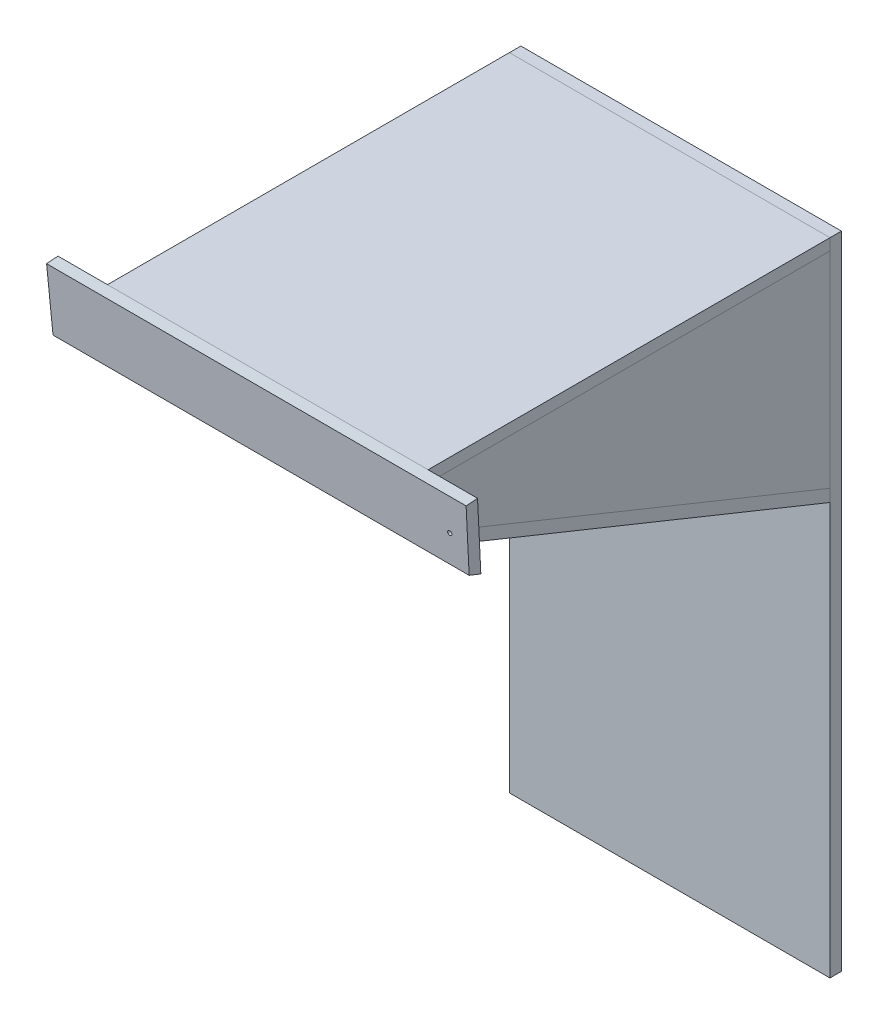
ISO-10303-21;
HEADER;
FILE_DESCRIPTION(('STEP AP214'),'2;1');
FILE_NAME('part.step','',(''),(''),'','','');
FILE_SCHEMA(('AUTOMOTIVE_DESIGN { 1 0 10303 214 1 1 1 1 }'));
ENDSEC;
DATA;
#1=APPLICATION_CONTEXT('core data for automotive mechanical design processes');
#2=APPLICATION_PROTOCOL_DEFINITION('international standard','automotive_design',2000,#1);
#3=PRODUCT_CONTEXT('',#1,'mechanical');
#4=PRODUCT('Part','Part','',(#3));
#5=PRODUCT_RELATED_PRODUCT_CATEGORY('part','',(#4));
#6=PRODUCT_DEFINITION_FORMATION('','',#4);
#7=PRODUCT_DEFINITION_CONTEXT('part definition',#1,'design');
#8=PRODUCT_DEFINITION('design','',#6,#7);
#9=PRODUCT_DEFINITION_SHAPE('','',#8);
#10=(LENGTH_UNIT() NAMED_UNIT(*) SI_UNIT(.MILLI.,.METRE.));
#11=(NAMED_UNIT(*) PLANE_ANGLE_UNIT() SI_UNIT($,.RADIAN.));
#12=(NAMED_UNIT(*) SI_UNIT($,.STERADIAN.) SOLID_ANGLE_UNIT());
#13=UNCERTAINTY_MEASURE_WITH_UNIT(LENGTH_MEASURE(1.E-05),#10,'distance_accuracy_value','');
#14=(GEOMETRIC_REPRESENTATION_CONTEXT(3) GLOBAL_UNCERTAINTY_ASSIGNED_CONTEXT((#13)) GLOBAL_UNIT_ASSIGNED_CONTEXT((#10,
#11,#12)) REPRESENTATION_CONTEXT('',''));
#15=CARTESIAN_POINT('',(0.,0.,0.));
#16=DIRECTION('',(0.,0.,1.));
#17=DIRECTION('',(1.,0.,0.));
#18=AXIS2_PLACEMENT_3D('',#15,#16,#17);
#19=CARTESIAN_POINT('',(266.700000000033,6812.73593849404,3017.19500052049));
#20=DIRECTION('',(1.,0.,0.));
#21=DIRECTION('',(0.,1.,0.));
#22=AXIS2_PLACEMENT_3D('',#19,#20,#21);
#23=PLANE('',#22);
#24=CARTESIAN_POINT('',(266.700000000038,6942.45499014005,3318.51));
#25=DIRECTION('',(-1.,1.19356260075173E-13,0.));
#26=DIRECTION('',(-1.19356260075173E-13,-1.,0.));
#27=AXIS2_PLACEMENT_3D('',#24,#25,#26);
#28=CIRCLE('',#27,3.49249999999985);
#29=CARTESIAN_POINT('',(266.700000000038,6938.96249014005,3318.51));
#30=VERTEX_POINT('',#29);
#31=EDGE_CURVE('P0_E19',#30,#30,#28,.T.);
#32=ORIENTED_EDGE('',*,*,#31,.T.);
#33=EDGE_LOOP('',(#32));
#34=FACE_BOUND('',#33,.T.);
#35=DIRECTION('',(0.,-0.997196386906827,-0.0748289111237776));
#36=VECTOR('',#35,1.);
#37=CARTESIAN_POINT('',(266.700000000036,6909.11469486815,3345.28092209158));
#38=LINE('',#37,#36);
#39=CARTESIAN_POINT('',(266.700000000034,6909.11469486815,3345.28092209158));
#40=VERTEX_POINT('',#39);
#41=CARTESIAN_POINT('',(266.700000000038,6983.72999014007,3350.880001041));
#42=VERTEX_POINT('',#41);
#43=EDGE_CURVE('P0_E53',#40,#42,#38,.F.);
#44=ORIENTED_EDGE('',*,*,#43,.F.);
#45=DIRECTION('',(0.,-0.37460659341596,-0.927183854566768));
#46=VECTOR('',#45,1.);
#47=CARTESIAN_POINT('',(266.700000000025,6641.741886848,2683.51));
#48=LINE('',#47,#46);
#49=CARTESIAN_POINT('',(266.700000000029,6641.741886848,2683.51));
#50=VERTEX_POINT('',#49);
#51=EDGE_CURVE('P0_E55',#50,#40,#48,.F.);
#52=ORIENTED_EDGE('',*,*,#51,.F.);
#53=DIRECTION('',(0.,1.,0.));
#54=VECTOR('',#53,1.);
#55=CARTESIAN_POINT('',(266.700000000038,6983.72999014007,2683.51));
#56=LINE('',#55,#54);
#57=CARTESIAN_POINT('',(266.700000000039,6983.72999014007,2683.51));
#58=VERTEX_POINT('',#57);
#59=EDGE_CURVE('P0_E57',#58,#50,#56,.F.);
#60=ORIENTED_EDGE('',*,*,#59,.F.);
#61=DIRECTION('',(0.,0.,1.));
#62=VECTOR('',#61,1.);
#63=CARTESIAN_POINT('',(266.700000000038,6983.72999014007,3350.880001041));
#64=LINE('',#63,#62);
#65=EDGE_CURVE('P0_E80',#42,#58,#64,.F.);
#66=ORIENTED_EDGE('',*,*,#65,.F.);
#67=EDGE_LOOP('',(#44,#52,#60,#66));
#68=FACE_BOUND('',#67,.T.);
#69=ADVANCED_FACE('P0_F16',(#34,#68),#23,.T.);
#70=CARTESIAN_POINT('',(266.700000000038,6983.72999014007,2683.51));
#71=DIRECTION('',(0.,0.,-1.));
#72=DIRECTION('',(-1.,0.,0.));
#73=AXIS2_PLACEMENT_3D('',#70,#71,#72);
#74=PLANE('',#73);
#75=DIRECTION('',(0.,-1.,0.));
#76=VECTOR('',#75,1.);
#77=CARTESIAN_POINT('',(247.650000000029,6812.73593849404,2683.51));
#78=LINE('',#77,#76);
#79=CARTESIAN_POINT('',(247.650000000033,6983.72999014007,2683.51));
#80=VERTEX_POINT('',#79);
#81=CARTESIAN_POINT('',(247.650000000027,6641.741886848,2683.51));
#82=VERTEX_POINT('',#81);
#83=EDGE_CURVE('P0_E84',#80,#82,#78,.T.);
#84=ORIENTED_EDGE('',*,*,#83,.F.);
#85=DIRECTION('',(-1.,0.,0.));
#86=VECTOR('',#85,1.);
#87=CARTESIAN_POINT('',(266.700000000038,6983.72999014007,2683.51));
#88=LINE('',#87,#86);
#89=EDGE_CURVE('P0_E68',#58,#80,#88,.T.);
#90=ORIENTED_EDGE('',*,*,#89,.F.);
#91=ORIENTED_EDGE('',*,*,#59,.T.);
#92=DIRECTION('',(1.,0.,0.));
#93=VECTOR('',#92,1.);
#94=CARTESIAN_POINT('',(266.700000000025,6641.741886848,2683.51));
#95=LINE('',#94,#93);
#96=EDGE_CURVE('P0_E62',#82,#50,#95,.T.);
#97=ORIENTED_EDGE('',*,*,#96,.F.);
#98=EDGE_LOOP('',(#84,#90,#91,#97));
#99=FACE_BOUND('',#98,.T.);
#100=ADVANCED_FACE('P0_F65',(#99),#74,.T.);
#101=CARTESIAN_POINT('',(266.700000000025,6641.741886848,2683.51));
#102=DIRECTION('',(0.,-0.927183854566768,0.37460659341596));
#103=DIRECTION('',(0.,-0.37460659341596,-0.927183854566768));
#104=AXIS2_PLACEMENT_3D('',#101,#102,#103);
#105=PLANE('',#104);
#106=DIRECTION('',(0.,0.374606593415949,0.927183854566772));
#107=VECTOR('',#106,1.);
#108=CARTESIAN_POINT('',(247.650000000019,6641.741886848,2683.51));
#109=LINE('',#108,#107);
#110=CARTESIAN_POINT('',(247.650000000037,6909.11469486815,3345.28092209158));
#111=VERTEX_POINT('',#110);
#112=EDGE_CURVE('P0_E73',#82,#111,#109,.T.);
#113=ORIENTED_EDGE('',*,*,#112,.F.);
#114=ORIENTED_EDGE('',*,*,#96,.T.);
#115=ORIENTED_EDGE('',*,*,#51,.T.);
#116=DIRECTION('',(1.,0.,0.));
#117=VECTOR('',#116,1.);
#118=CARTESIAN_POINT('',(266.700000000036,6909.11469486815,3345.28092209158));
#119=LINE('',#118,#117);
#120=EDGE_CURVE('P0_E76',#111,#40,#119,.T.);
#121=ORIENTED_EDGE('',*,*,#120,.F.);
#122=EDGE_LOOP('',(#113,#114,#115,#121));
#123=FACE_BOUND('',#122,.T.);
#124=ADVANCED_FACE('P0_F71',(#123),#105,.T.);
#125=CARTESIAN_POINT('',(266.700000000036,6909.11469486815,3345.28092209158));
#126=DIRECTION('',(0.,-0.0748289111237776,0.997196386906827));
#127=DIRECTION('',(0.,-0.997196386906827,-0.0748289111237776));
#128=AXIS2_PLACEMENT_3D('',#125,#126,#127);
#129=PLANE('',#128);
#130=DIRECTION('',(0.,0.997196386906838,0.074828911123633));
#131=VECTOR('',#130,1.);
#132=CARTESIAN_POINT('',(247.650000000035,6909.11469486815,3345.28092209158));
#133=LINE('',#132,#131);
#134=CARTESIAN_POINT('',(247.650000000039,6983.72999014007,3350.880001041));
#135=VERTEX_POINT('',#134);
#136=EDGE_CURVE('P0_E87',#111,#135,#133,.T.);
#137=ORIENTED_EDGE('',*,*,#136,.F.);
#138=ORIENTED_EDGE('',*,*,#120,.T.);
#139=ORIENTED_EDGE('',*,*,#43,.T.);
#140=DIRECTION('',(-1.,0.,0.));
#141=VECTOR('',#140,1.);
#142=CARTESIAN_POINT('',(266.700000000038,6983.72999014007,3350.880001041));
#143=LINE('',#142,#141);
#144=EDGE_CURVE('P0_E33',#135,#42,#143,.F.);
#145=ORIENTED_EDGE('',*,*,#144,.F.);
#146=EDGE_LOOP('',(#137,#138,#139,#145));
#147=FACE_BOUND('',#146,.T.);
#148=ADVANCED_FACE('P0_F95',(#147),#129,.T.);
#149=CARTESIAN_POINT('',(266.700000000038,6983.72999014007,3350.880001041));
#150=DIRECTION('',(0.,1.,0.));
#151=DIRECTION('',(-1.,0.,0.));
#152=AXIS2_PLACEMENT_3D('',#149,#150,#151);
#153=PLANE('',#152);
#154=DIRECTION('',(0.,0.,1.));
#155=VECTOR('',#154,1.);
#156=CARTESIAN_POINT('',(247.650000000039,6983.72999014007,3017.19500052049));
#157=LINE('',#156,#155);
#158=EDGE_CURVE('P0_E25',#135,#80,#157,.F.);
#159=ORIENTED_EDGE('',*,*,#158,.F.);
#160=ORIENTED_EDGE('',*,*,#144,.T.);
#161=ORIENTED_EDGE('',*,*,#65,.T.);
#162=ORIENTED_EDGE('',*,*,#89,.T.);
#163=EDGE_LOOP('',(#159,#160,#161,#162));
#164=FACE_BOUND('',#163,.T.);
#165=ADVANCED_FACE('P0_F94',(#164),#153,.T.);
#166=CARTESIAN_POINT('',(285.750000000008,6942.45499014005,3318.51));
#167=DIRECTION('',(-1.,1.19356260075173E-13,0.));
#168=DIRECTION('',(-1.19356260075173E-13,-1.,0.));
#169=AXIS2_PLACEMENT_3D('',#166,#167,#168);
#170=CYLINDRICAL_SURFACE('',#169,3.49249999999985);
#171=CARTESIAN_POINT('',(247.650000000035,6942.45499014005,3318.51));
#172=DIRECTION('',(-1.,1.19356260075173E-13,0.));
#173=DIRECTION('',(-1.19356260075173E-13,-1.,0.));
#174=AXIS2_PLACEMENT_3D('',#171,#172,#173);
#175=CIRCLE('',#174,3.49249999999985);
#176=CARTESIAN_POINT('',(247.650000000035,6938.96249014005,3318.51));
#177=VERTEX_POINT('',#176);
#178=EDGE_CURVE('P0_E11',#177,#177,#175,.F.);
#179=ORIENTED_EDGE('',*,*,#178,.F.);
#180=EDGE_LOOP('',(#179));
#181=FACE_BOUND('',#180,.T.);
#182=ORIENTED_EDGE('',*,*,#31,.F.);
#183=EDGE_LOOP('',(#182));
#184=FACE_BOUND('',#183,.T.);
#185=ADVANCED_FACE('P0_F103',(#181,#184),#170,.F.);
#186=CARTESIAN_POINT('',(247.650000000029,6812.73593849404,3017.19500052049));
#187=DIRECTION('',(-1.,0.,0.));
#188=DIRECTION('',(0.,-1.,0.));
#189=AXIS2_PLACEMENT_3D('',#186,#187,#188);
#190=PLANE('',#189);
#191=ORIENTED_EDGE('',*,*,#178,.T.);
#192=EDGE_LOOP('',(#191));
#193=FACE_BOUND('',#192,.T.);
#194=ORIENTED_EDGE('',*,*,#136,.T.);
#195=ORIENTED_EDGE('',*,*,#158,.T.);
#196=ORIENTED_EDGE('',*,*,#83,.T.);
#197=ORIENTED_EDGE('',*,*,#112,.T.);
#198=EDGE_LOOP('',(#194,#195,#196,#197));
#199=FACE_BOUND('',#198,.T.);
#200=ADVANCED_FACE('P0_F92',(#193,#199),#190,.T.);
#201=CLOSED_SHELL('',(#69,#100,#124,#148,#165,#185,#200));
#202=MANIFOLD_SOLID_BREP('P0_B1',#201);
#203=CARTESIAN_POINT('',(0.,6621.1958,2683.51));
#204=DIRECTION('',(0.,-0.927183854566768,0.374606593415961));
#205=DIRECTION('',(0.,-0.374606593415961,-0.927183854566768));
#206=AXIS2_PLACEMENT_3D('',#203,#204,#205);
#207=PLANE('',#206);
#208=DIRECTION('',(0.,0.374606593415957,0.927183854566769));
#209=VECTOR('',#208,1.);
#210=CARTESIAN_POINT('',(-266.700000000025,6621.1958,2683.51));
#211=LINE('',#210,#209);
#212=CARTESIAN_POINT('',(-266.700000000028,6621.1958,2683.51));
#213=VERTEX_POINT('',#212);
#214=CARTESIAN_POINT('',(-266.700000000035,6887.92621916045,3343.69095387015));
#215=VERTEX_POINT('',#214);
#216=EDGE_CURVE('P1_E67',#213,#215,#211,.T.);
#217=ORIENTED_EDGE('',*,*,#216,.F.);
#218=DIRECTION('',(-1.,0.,0.));
#219=VECTOR('',#218,1.);
#220=CARTESIAN_POINT('',(0.,6621.1958,2683.51));
#221=LINE('',#220,#219);
#222=CARTESIAN_POINT('',(266.700000000025,6621.1958,2683.51));
#223=VERTEX_POINT('',#222);
#224=EDGE_CURVE('P1_E54',#223,#213,#221,.T.);
#225=ORIENTED_EDGE('',*,*,#224,.F.);
#226=DIRECTION('',(0.,-0.374606593415957,-0.927183854566769));
#227=VECTOR('',#226,1.);
#228=CARTESIAN_POINT('',(266.700000000035,6887.92621916045,3343.69095387015));
#229=LINE('',#228,#227);
#230=CARTESIAN_POINT('',(266.700000000033,6887.92621916045,3343.69095387015));
#231=VERTEX_POINT('',#230);
#232=EDGE_CURVE('P1_E19',#231,#223,#229,.T.);
#233=ORIENTED_EDGE('',*,*,#232,.F.);
#234=DIRECTION('',(1.,0.,0.));
#235=VECTOR('',#234,1.);
#236=CARTESIAN_POINT('',(0.,6887.92621916045,3343.69095387015));
#237=LINE('',#236,#235);
#238=EDGE_CURVE('P1_E80',#215,#231,#237,.T.);
#239=ORIENTED_EDGE('',*,*,#238,.F.);
#240=EDGE_LOOP('',(#217,#225,#233,#239));
#241=FACE_BOUND('',#240,.T.);
#242=ADVANCED_FACE('P1_F16',(#241),#207,.T.);
#243=CARTESIAN_POINT('',(266.70000000003,6765.15524743407,3014.39546104579));
#244=DIRECTION('',(1.,0.,0.));
#245=DIRECTION('',(0.,1.,0.));
#246=AXIS2_PLACEMENT_3D('',#243,#244,#245);
#247=PLANE('',#246);
#248=DIRECTION('',(0.,1.,0.));
#249=VECTOR('',#248,1.);
#250=CARTESIAN_POINT('',(266.700000000025,6641.741886848,2683.51));
#251=LINE('',#250,#249);
#252=CARTESIAN_POINT('',(266.700000000028,6641.741886848,2683.51));
#253=VERTEX_POINT('',#252);
#254=EDGE_CURVE('P1_E60',#253,#223,#251,.F.);
#255=ORIENTED_EDGE('',*,*,#254,.F.);
#256=DIRECTION('',(0.,0.37460659341596,0.927183854566768));
#257=VECTOR('',#256,1.);
#258=CARTESIAN_POINT('',(266.700000000036,6909.11469486815,3345.28092209158));
#259=LINE('',#258,#257);
#260=CARTESIAN_POINT('',(266.700000000036,6909.11469486815,3345.28092209157));
#261=VERTEX_POINT('',#260);
#262=EDGE_CURVE('P1_E82',#261,#253,#259,.F.);
#263=ORIENTED_EDGE('',*,*,#262,.F.);
#264=DIRECTION('',(0.,-0.997196386906415,-0.0748289111292681));
#265=VECTOR('',#264,1.);
#266=CARTESIAN_POINT('',(266.700000000036,6887.92621916045,3343.69095387015));
#267=LINE('',#266,#265);
#268=EDGE_CURVE('P1_E63',#231,#261,#267,.F.);
#269=ORIENTED_EDGE('',*,*,#268,.F.);
#270=ORIENTED_EDGE('',*,*,#232,.T.);
#271=EDGE_LOOP('',(#255,#263,#269,#270));
#272=FACE_BOUND('',#271,.T.);
#273=ADVANCED_FACE('P1_F59',(#272),#247,.T.);
#274=CARTESIAN_POINT('',(0.,6641.741886848,2683.51));
#275=DIRECTION('',(0.,0.,-1.));
#276=DIRECTION('',(-1.,0.,0.));
#277=AXIS2_PLACEMENT_3D('',#274,#275,#276);
#278=PLANE('',#277);
#279=DIRECTION('',(0.,-1.,0.));
#280=VECTOR('',#279,1.);
#281=CARTESIAN_POINT('',(-266.70000000003,6765.15524743407,2683.51));
#282=LINE('',#281,#280);
#283=CARTESIAN_POINT('',(-266.700000000026,6641.741886848,2683.51));
#284=VERTEX_POINT('',#283);
#285=EDGE_CURVE('P1_E69',#284,#213,#282,.T.);
#286=ORIENTED_EDGE('',*,*,#285,.F.);
#287=DIRECTION('',(1.,0.,0.));
#288=VECTOR('',#287,1.);
#289=CARTESIAN_POINT('',(0.,6641.74188684799,2683.51));
#290=LINE('',#289,#288);
#291=EDGE_CURVE('P1_E73',#253,#284,#290,.F.);
#292=ORIENTED_EDGE('',*,*,#291,.F.);
#293=ORIENTED_EDGE('',*,*,#254,.T.);
#294=ORIENTED_EDGE('',*,*,#224,.T.);
#295=EDGE_LOOP('',(#286,#292,#293,#294));
#296=FACE_BOUND('',#295,.T.);
#297=ADVANCED_FACE('P1_F71',(#296),#278,.T.);
#298=CARTESIAN_POINT('',(-266.70000000003,6765.15524743407,3014.39546104579));
#299=DIRECTION('',(-1.,0.,0.));
#300=DIRECTION('',(0.,-1.,0.));
#301=AXIS2_PLACEMENT_3D('',#298,#299,#300);
#302=PLANE('',#301);
#303=ORIENTED_EDGE('',*,*,#285,.T.);
#304=ORIENTED_EDGE('',*,*,#216,.T.);
#305=DIRECTION('',(0.,-0.997196386906415,-0.0748289111292681));
#306=VECTOR('',#305,1.);
#307=CARTESIAN_POINT('',(-266.700000000036,6887.92621916045,3343.69095387015));
#308=LINE('',#307,#306);
#309=CARTESIAN_POINT('',(-266.700000000033,6909.11469486815,3345.28092209157));
#310=VERTEX_POINT('',#309);
#311=EDGE_CURVE('P1_E34',#310,#215,#308,.T.);
#312=ORIENTED_EDGE('',*,*,#311,.F.);
#313=DIRECTION('',(0.,0.37460659341596,0.927183854566768));
#314=VECTOR('',#313,1.);
#315=CARTESIAN_POINT('',(-266.700000000026,6909.11469486815,3345.28092209158));
#316=LINE('',#315,#314);
#317=EDGE_CURVE('P1_E25',#284,#310,#316,.T.);
#318=ORIENTED_EDGE('',*,*,#317,.F.);
#319=EDGE_LOOP('',(#303,#304,#312,#318));
#320=FACE_BOUND('',#319,.T.);
#321=ADVANCED_FACE('P1_F88',(#320),#302,.T.);
#322=CARTESIAN_POINT('',(0.,6887.92621916045,3343.69095387015));
#323=DIRECTION('',(0.,-0.0748289111292681,0.997196386906415));
#324=DIRECTION('',(0.,-0.997196386906415,-0.0748289111292681));
#325=AXIS2_PLACEMENT_3D('',#322,#323,#324);
#326=PLANE('',#325);
#327=ORIENTED_EDGE('',*,*,#311,.T.);
#328=ORIENTED_EDGE('',*,*,#238,.T.);
#329=ORIENTED_EDGE('',*,*,#268,.T.);
#330=DIRECTION('',(1.,0.,0.));
#331=VECTOR('',#330,1.);
#332=CARTESIAN_POINT('',(0.,6909.11469486815,3345.28092209158));
#333=LINE('',#332,#331);
#334=EDGE_CURVE('P1_E11',#310,#261,#333,.T.);
#335=ORIENTED_EDGE('',*,*,#334,.F.);
#336=EDGE_LOOP('',(#327,#328,#329,#335));
#337=FACE_BOUND('',#336,.T.);
#338=ADVANCED_FACE('P1_F90',(#337),#326,.T.);
#339=CARTESIAN_POINT('',(0.,6909.11469486815,3345.28092209158));
#340=DIRECTION('',(0.,0.927183854566768,-0.37460659341596));
#341=DIRECTION('',(0.,0.37460659341596,0.927183854566768));
#342=AXIS2_PLACEMENT_3D('',#339,#340,#341);
#343=PLANE('',#342);
#344=ORIENTED_EDGE('',*,*,#317,.T.);
#345=ORIENTED_EDGE('',*,*,#334,.T.);
#346=ORIENTED_EDGE('',*,*,#262,.T.);
#347=ORIENTED_EDGE('',*,*,#291,.T.);
#348=EDGE_LOOP('',(#344,#345,#346,#347));
#349=FACE_BOUND('',#348,.T.);
#350=ADVANCED_FACE('P1_F87',(#349),#343,.T.);
#351=CLOSED_SHELL('',(#242,#273,#297,#321,#338,#350));
#352=MANIFOLD_SOLID_BREP('P1_B1',#351);
#353=CARTESIAN_POINT('',(-266.700000000033,6812.73593849404,3017.19500052049));
#354=DIRECTION('',(1.,0.,0.));
#355=DIRECTION('',(0.,1.,0.));
#356=AXIS2_PLACEMENT_3D('',#353,#354,#355);
#357=PLANE('',#356);
#358=CARTESIAN_POINT('',(-266.700000000027,6942.45499014012,3318.50999999998));
#359=DIRECTION('',(-1.,1.19356260075173E-13,0.));
#360=DIRECTION('',(-1.19356260075173E-13,-1.,0.));
#361=AXIS2_PLACEMENT_3D('',#358,#359,#360);
#362=CIRCLE('',#361,3.49249999999985);
#363=CARTESIAN_POINT('',(-266.700000000028,6938.96249014011,3318.50999999998));
#364=VERTEX_POINT('',#363);
#365=EDGE_CURVE('P2_E19',#364,#364,#362,.F.);
#366=ORIENTED_EDGE('',*,*,#365,.T.);
#367=EDGE_LOOP('',(#366));
#368=FACE_BOUND('',#367,.T.);
#369=DIRECTION('',(0.,0.37460659341596,0.927183854566768));
#370=VECTOR('',#369,1.);
#371=CARTESIAN_POINT('',(-266.700000000025,6641.741886848,2683.51));
#372=LINE('',#371,#370);
#373=CARTESIAN_POINT('',(-266.700000000029,6641.741886848,2683.51));
#374=VERTEX_POINT('',#373);
#375=CARTESIAN_POINT('',(-266.700000000031,6909.11469486815,3345.28092209158));
#376=VERTEX_POINT('',#375);
#377=EDGE_CURVE('P2_E57',#374,#376,#372,.T.);
#378=ORIENTED_EDGE('',*,*,#377,.T.);
#379=DIRECTION('',(0.,0.997196386906827,0.0748289111237776));
#380=VECTOR('',#379,1.);
#381=CARTESIAN_POINT('',(-266.700000000036,6909.11469486815,3345.28092209158));
#382=LINE('',#381,#380);
#383=CARTESIAN_POINT('',(-266.700000000037,6983.72999014007,3350.880001041));
#384=VERTEX_POINT('',#383);
#385=EDGE_CURVE('P2_E54',#376,#384,#382,.T.);
#386=ORIENTED_EDGE('',*,*,#385,.T.);
#387=DIRECTION('',(0.,0.,1.));
#388=VECTOR('',#387,1.);
#389=CARTESIAN_POINT('',(-266.700000000038,6983.72999014007,3350.880001041));
#390=LINE('',#389,#388);
#391=CARTESIAN_POINT('',(-266.700000000038,6983.72999014007,2683.51));
#392=VERTEX_POINT('',#391);
#393=EDGE_CURVE('P2_E78',#384,#392,#390,.F.);
#394=ORIENTED_EDGE('',*,*,#393,.T.);
#395=DIRECTION('',(0.,1.,0.));
#396=VECTOR('',#395,1.);
#397=CARTESIAN_POINT('',(-266.700000000038,6983.72999014007,2683.51));
#398=LINE('',#397,#396);
#399=EDGE_CURVE('P2_E58',#392,#374,#398,.F.);
#400=ORIENTED_EDGE('',*,*,#399,.T.);
#401=EDGE_LOOP('',(#378,#386,#394,#400));
#402=FACE_BOUND('',#401,.T.);
#403=ADVANCED_FACE('P2_F16',(#368,#402),#357,.F.);
#404=CARTESIAN_POINT('',(-266.700000000025,6641.741886848,2683.51));
#405=DIRECTION('',(0.,0.927183854566768,-0.37460659341596));
#406=DIRECTION('',(0.,0.37460659341596,0.927183854566768));
#407=AXIS2_PLACEMENT_3D('',#404,#405,#406);
#408=PLANE('',#407);
#409=DIRECTION('',(1.,0.,0.));
#410=VECTOR('',#409,1.);
#411=CARTESIAN_POINT('',(-266.700000000038,6641.741886848,2683.51));
#412=LINE('',#411,#410);
#413=CARTESIAN_POINT('',(-247.65000000003,6641.741886848,2683.51));
#414=VERTEX_POINT('',#413);
#415=EDGE_CURVE('P2_E80',#374,#414,#412,.T.);
#416=ORIENTED_EDGE('',*,*,#415,.T.);
#417=DIRECTION('',(0.,0.374606593415949,0.927183854566772));
#418=VECTOR('',#417,1.);
#419=CARTESIAN_POINT('',(-247.650000000019,6641.741886848,2683.51));
#420=LINE('',#419,#418);
#421=CARTESIAN_POINT('',(-247.650000000037,6909.11469486815,3345.28092209158));
#422=VERTEX_POINT('',#421);
#423=EDGE_CURVE('P2_E74',#414,#422,#420,.T.);
#424=ORIENTED_EDGE('',*,*,#423,.T.);
#425=DIRECTION('',(1.,0.,0.));
#426=VECTOR('',#425,1.);
#427=CARTESIAN_POINT('',(-266.700000000036,6909.11469486815,3345.28092209158));
#428=LINE('',#427,#426);
#429=EDGE_CURVE('P2_E63',#422,#376,#428,.F.);
#430=ORIENTED_EDGE('',*,*,#429,.T.);
#431=ORIENTED_EDGE('',*,*,#377,.F.);
#432=EDGE_LOOP('',(#416,#424,#430,#431));
#433=FACE_BOUND('',#432,.T.);
#434=ADVANCED_FACE('P2_F73',(#433),#408,.F.);
#435=CARTESIAN_POINT('',(-266.700000000036,6909.11469486815,3345.28092209158));
#436=DIRECTION('',(0.,0.0748289111237776,-0.997196386906827));
#437=DIRECTION('',(0.,0.997196386906827,0.0748289111237776));
#438=AXIS2_PLACEMENT_3D('',#435,#436,#437);
#439=PLANE('',#438);
#440=ORIENTED_EDGE('',*,*,#429,.F.);
#441=DIRECTION('',(0.,0.997196386906838,0.074828911123633));
#442=VECTOR('',#441,1.);
#443=CARTESIAN_POINT('',(-247.650000000035,6909.11469486815,3345.28092209158));
#444=LINE('',#443,#442);
#445=CARTESIAN_POINT('',(-247.650000000039,6983.72999014007,3350.880001041));
#446=VERTEX_POINT('',#445);
#447=EDGE_CURVE('P2_E85',#422,#446,#444,.T.);
#448=ORIENTED_EDGE('',*,*,#447,.T.);
#449=DIRECTION('',(1.,0.,0.));
#450=VECTOR('',#449,1.);
#451=CARTESIAN_POINT('',(-266.700000000038,6983.72999014007,3350.880001041));
#452=LINE('',#451,#450);
#453=EDGE_CURVE('P2_E70',#446,#384,#452,.F.);
#454=ORIENTED_EDGE('',*,*,#453,.T.);
#455=ORIENTED_EDGE('',*,*,#385,.F.);
#456=EDGE_LOOP('',(#440,#448,#454,#455));
#457=FACE_BOUND('',#456,.T.);
#458=ADVANCED_FACE('P2_F67',(#457),#439,.F.);
#459=CARTESIAN_POINT('',(-266.700000000038,6983.72999014007,3350.880001041));
#460=DIRECTION('',(0.,-1.,0.));
#461=DIRECTION('',(1.,0.,0.));
#462=AXIS2_PLACEMENT_3D('',#459,#460,#461);
#463=PLANE('',#462);
#464=ORIENTED_EDGE('',*,*,#453,.F.);
#465=DIRECTION('',(0.,0.,1.));
#466=VECTOR('',#465,1.);
#467=CARTESIAN_POINT('',(-247.650000000039,6983.72999014007,3017.19500052049));
#468=LINE('',#467,#466);
#469=CARTESIAN_POINT('',(-247.650000000036,6983.72999014007,2683.51));
#470=VERTEX_POINT('',#469);
#471=EDGE_CURVE('P2_E87',#446,#470,#468,.F.);
#472=ORIENTED_EDGE('',*,*,#471,.T.);
#473=DIRECTION('',(1.,0.,0.));
#474=VECTOR('',#473,1.);
#475=CARTESIAN_POINT('',(-266.700000000038,6983.72999014007,2683.51));
#476=LINE('',#475,#474);
#477=EDGE_CURVE('P2_E33',#470,#392,#476,.F.);
#478=ORIENTED_EDGE('',*,*,#477,.T.);
#479=ORIENTED_EDGE('',*,*,#393,.F.);
#480=EDGE_LOOP('',(#464,#472,#478,#479));
#481=FACE_BOUND('',#480,.T.);
#482=ADVANCED_FACE('P2_F95',(#481),#463,.F.);
#483=CARTESIAN_POINT('',(-266.700000000038,6983.72999014007,2683.51));
#484=DIRECTION('',(0.,0.,1.));
#485=DIRECTION('',(1.,0.,0.));
#486=AXIS2_PLACEMENT_3D('',#483,#484,#485);
#487=PLANE('',#486);
#488=ORIENTED_EDGE('',*,*,#477,.F.);
#489=DIRECTION('',(0.,-1.,0.));
#490=VECTOR('',#489,1.);
#491=CARTESIAN_POINT('',(-247.650000000029,6812.73593849404,2683.51));
#492=LINE('',#491,#490);
#493=EDGE_CURVE('P2_E25',#470,#414,#492,.T.);
#494=ORIENTED_EDGE('',*,*,#493,.T.);
#495=ORIENTED_EDGE('',*,*,#415,.F.);
#496=ORIENTED_EDGE('',*,*,#399,.F.);
#497=EDGE_LOOP('',(#488,#494,#495,#496));
#498=FACE_BOUND('',#497,.T.);
#499=ADVANCED_FACE('P2_F90',(#498),#487,.F.);
#500=CARTESIAN_POINT('',(285.750000000008,6942.45499014005,3318.51));
#501=DIRECTION('',(-1.,1.19356260075173E-13,0.));
#502=DIRECTION('',(-1.19356260075173E-13,-1.,0.));
#503=AXIS2_PLACEMENT_3D('',#500,#501,#502);
#504=CYLINDRICAL_SURFACE('',#503,3.49249999999985);
#505=CARTESIAN_POINT('',(-247.650000000023,6942.45499014011,3318.50999999998));
#506=DIRECTION('',(-1.,1.19356260075173E-13,0.));
#507=DIRECTION('',(-1.19356260075173E-13,-1.,0.));
#508=AXIS2_PLACEMENT_3D('',#505,#506,#507);
#509=CIRCLE('',#508,3.49249999999985);
#510=CARTESIAN_POINT('',(-247.650000000023,6938.96249014011,3318.50999999998));
#511=VERTEX_POINT('',#510);
#512=EDGE_CURVE('P2_E11',#511,#511,#509,.F.);
#513=ORIENTED_EDGE('',*,*,#512,.T.);
#514=EDGE_LOOP('',(#513));
#515=FACE_BOUND('',#514,.T.);
#516=ORIENTED_EDGE('',*,*,#365,.F.);
#517=EDGE_LOOP('',(#516));
#518=FACE_BOUND('',#517,.T.);
#519=ADVANCED_FACE('P2_F103',(#515,#518),#504,.F.);
#520=CARTESIAN_POINT('',(-247.650000000029,6812.73593849404,3017.19500052049));
#521=DIRECTION('',(-1.,0.,0.));
#522=DIRECTION('',(0.,-1.,0.));
#523=AXIS2_PLACEMENT_3D('',#520,#521,#522);
#524=PLANE('',#523);
#525=ORIENTED_EDGE('',*,*,#512,.F.);
#526=EDGE_LOOP('',(#525));
#527=FACE_BOUND('',#526,.T.);
#528=ORIENTED_EDGE('',*,*,#471,.F.);
#529=ORIENTED_EDGE('',*,*,#447,.F.);
#530=ORIENTED_EDGE('',*,*,#423,.F.);
#531=ORIENTED_EDGE('',*,*,#493,.F.);
#532=EDGE_LOOP('',(#528,#529,#530,#531));
#533=FACE_BOUND('',#532,.T.);
#534=ADVANCED_FACE('P2_F93',(#527,#533),#524,.F.);
#535=CLOSED_SHELL('',(#403,#434,#458,#482,#499,#519,#534));
#536=MANIFOLD_SOLID_BREP('P2_B1',#535);
#537=CARTESIAN_POINT('',(266.700000000038,6983.72999014007,2683.51));
#538=DIRECTION('',(0.,-1.,0.));
#539=DIRECTION('',(1.,0.,0.));
#540=AXIS2_PLACEMENT_3D('',#537,#538,#539);
#541=PLANE('',#540);
#542=DIRECTION('',(0.,0.,1.));
#543=VECTOR('',#542,1.);
#544=CARTESIAN_POINT('',(266.70000000004,6983.72999014007,3017.90975736907));
#545=LINE('',#544,#543);
#546=CARTESIAN_POINT('',(266.700000000039,6983.72999014007,3350.880001041));
#547=VERTEX_POINT('',#546);
#548=CARTESIAN_POINT('',(266.70000000004,6983.72999014007,2683.51));
#549=VERTEX_POINT('',#548);
#550=EDGE_CURVE('P3_E67',#547,#549,#545,.F.);
#551=ORIENTED_EDGE('',*,*,#550,.F.);
#552=DIRECTION('',(1.,0.,0.));
#553=VECTOR('',#552,1.);
#554=CARTESIAN_POINT('',(266.700000000038,6983.72999014007,3350.880001041));
#555=LINE('',#554,#553);
#556=CARTESIAN_POINT('',(-266.70000000004,6983.72999014008,3350.880001041));
#557=VERTEX_POINT('',#556);
#558=EDGE_CURVE('P3_E54',#557,#547,#555,.T.);
#559=ORIENTED_EDGE('',*,*,#558,.F.);
#560=DIRECTION('',(0.,0.,1.));
#561=VECTOR('',#560,1.);
#562=CARTESIAN_POINT('',(-266.70000000004,6983.72999014007,3017.90975736907));
#563=LINE('',#562,#561);
#564=CARTESIAN_POINT('',(-266.700000000039,6983.72999014008,2683.51));
#565=VERTEX_POINT('',#564);
#566=EDGE_CURVE('P3_E19',#565,#557,#563,.T.);
#567=ORIENTED_EDGE('',*,*,#566,.F.);
#568=DIRECTION('',(-1.,0.,0.));
#569=VECTOR('',#568,1.);
#570=CARTESIAN_POINT('',(266.700000000041,6983.72999014007,2683.51));
#571=LINE('',#570,#569);
#572=EDGE_CURVE('P3_E80',#549,#565,#571,.T.);
#573=ORIENTED_EDGE('',*,*,#572,.F.);
#574=EDGE_LOOP('',(#551,#559,#567,#573));
#575=FACE_BOUND('',#574,.T.);
#576=ADVANCED_FACE('P3_F16',(#575),#541,.T.);
#577=CARTESIAN_POINT('',(-266.700000000041,6993.25499753082,3017.90975736907));
#578=DIRECTION('',(-1.,0.,0.));
#579=DIRECTION('',(0.,-1.,0.));
#580=AXIS2_PLACEMENT_3D('',#577,#578,#579);
#581=PLANE('',#580);
#582=ORIENTED_EDGE('',*,*,#566,.T.);
#583=DIRECTION('',(0.,-0.997196386753433,-0.07482891316796));
#584=VECTOR('',#583,1.);
#585=CARTESIAN_POINT('',(-266.700000000041,6983.72999014007,3350.88000104099));
#586=LINE('',#585,#584);
#587=CARTESIAN_POINT('',(-266.700000000041,7002.77999014677,3352.30949986753));
#588=VERTEX_POINT('',#587);
#589=EDGE_CURVE('P3_E60',#588,#557,#586,.T.);
#590=ORIENTED_EDGE('',*,*,#589,.F.);
#591=DIRECTION('',(0.,0.,1.));
#592=VECTOR('',#591,1.);
#593=CARTESIAN_POINT('',(-266.700000000041,7002.77999014009,3352.30949995672));
#594=LINE('',#593,#592);
#595=CARTESIAN_POINT('',(-266.70000000004,7002.77999014008,2683.51));
#596=VERTEX_POINT('',#595);
#597=EDGE_CURVE('P3_E82',#596,#588,#594,.T.);
#598=ORIENTED_EDGE('',*,*,#597,.F.);
#599=DIRECTION('',(0.,1.,0.));
#600=VECTOR('',#599,1.);
#601=CARTESIAN_POINT('',(-266.700000000038,7002.77999014007,2683.51));
#602=LINE('',#601,#600);
#603=EDGE_CURVE('P3_E63',#565,#596,#602,.T.);
#604=ORIENTED_EDGE('',*,*,#603,.F.);
#605=EDGE_LOOP('',(#582,#590,#598,#604));
#606=FACE_BOUND('',#605,.T.);
#607=ADVANCED_FACE('P3_F59',(#606),#581,.T.);
#608=CARTESIAN_POINT('',(266.700000000038,6983.72999014007,3350.880001041));
#609=DIRECTION('',(0.,-0.07482891316796,0.997196386753433));
#610=DIRECTION('',(0.,-0.997196386753433,-0.07482891316796));
#611=AXIS2_PLACEMENT_3D('',#608,#609,#610);
#612=PLANE('',#611);
#613=DIRECTION('',(0.,-0.997196385352011,-0.0748289318437974));
#614=VECTOR('',#613,1.);
#615=CARTESIAN_POINT('',(266.700000000041,7002.77999014007,3352.30949995672));
#616=LINE('',#615,#614);
#617=CARTESIAN_POINT('',(266.700000000039,7002.77999015346,3352.30949977833));
#618=VERTEX_POINT('',#617);
#619=EDGE_CURVE('P3_E69',#618,#547,#616,.T.);
#620=ORIENTED_EDGE('',*,*,#619,.F.);
#621=DIRECTION('',(-1.,0.,0.));
#622=VECTOR('',#621,1.);
#623=CARTESIAN_POINT('',(266.700000000041,7002.77999014007,3352.30949995672));
#624=LINE('',#623,#622);
#625=EDGE_CURVE('P3_E73',#588,#618,#624,.F.);
#626=ORIENTED_EDGE('',*,*,#625,.F.);
#627=ORIENTED_EDGE('',*,*,#589,.T.);
#628=ORIENTED_EDGE('',*,*,#558,.T.);
#629=EDGE_LOOP('',(#620,#626,#627,#628));
#630=FACE_BOUND('',#629,.T.);
#631=ADVANCED_FACE('P3_F71',(#630),#612,.T.);
#632=CARTESIAN_POINT('',(266.700000000041,6993.25499753079,3017.90975736907));
#633=DIRECTION('',(1.,0.,0.));
#634=DIRECTION('',(0.,1.,0.));
#635=AXIS2_PLACEMENT_3D('',#632,#633,#634);
#636=PLANE('',#635);
#637=ORIENTED_EDGE('',*,*,#619,.T.);
#638=ORIENTED_EDGE('',*,*,#550,.T.);
#639=DIRECTION('',(0.,1.,0.));
#640=VECTOR('',#639,1.);
#641=CARTESIAN_POINT('',(266.700000000041,7002.77999014007,2683.51));
#642=LINE('',#641,#640);
#643=CARTESIAN_POINT('',(266.700000000041,7002.77999014007,2683.51));
#644=VERTEX_POINT('',#643);
#645=EDGE_CURVE('P3_E34',#644,#549,#642,.F.);
#646=ORIENTED_EDGE('',*,*,#645,.F.);
#647=DIRECTION('',(0.,0.,1.));
#648=VECTOR('',#647,1.);
#649=CARTESIAN_POINT('',(266.700000000041,7002.77999014007,3352.30949995672));
#650=LINE('',#649,#648);
#651=EDGE_CURVE('P3_E25',#618,#644,#650,.F.);
#652=ORIENTED_EDGE('',*,*,#651,.F.);
#653=EDGE_LOOP('',(#637,#638,#646,#652));
#654=FACE_BOUND('',#653,.T.);
#655=ADVANCED_FACE('P3_F88',(#654),#636,.T.);
#656=CARTESIAN_POINT('',(266.700000000041,7002.77999014007,2683.51));
#657=DIRECTION('',(0.,0.,-1.));
#658=DIRECTION('',(-1.,0.,0.));
#659=AXIS2_PLACEMENT_3D('',#656,#657,#658);
#660=PLANE('',#659);
#661=ORIENTED_EDGE('',*,*,#645,.T.);
#662=ORIENTED_EDGE('',*,*,#572,.T.);
#663=ORIENTED_EDGE('',*,*,#603,.T.);
#664=DIRECTION('',(-1.,0.,0.));
#665=VECTOR('',#664,1.);
#666=CARTESIAN_POINT('',(266.700000000041,7002.77999014007,2683.51));
#667=LINE('',#666,#665);
#668=EDGE_CURVE('P3_E11',#644,#596,#667,.T.);
#669=ORIENTED_EDGE('',*,*,#668,.F.);
#670=EDGE_LOOP('',(#661,#662,#663,#669));
#671=FACE_BOUND('',#670,.T.);
#672=ADVANCED_FACE('P3_F90',(#671),#660,.T.);
#673=CARTESIAN_POINT('',(266.700000000041,7002.77999014007,3352.30949995672));
#674=DIRECTION('',(0.,1.,0.));
#675=DIRECTION('',(-1.,0.,0.));
#676=AXIS2_PLACEMENT_3D('',#673,#674,#675);
#677=PLANE('',#676);
#678=ORIENTED_EDGE('',*,*,#651,.T.);
#679=ORIENTED_EDGE('',*,*,#668,.T.);
#680=ORIENTED_EDGE('',*,*,#597,.T.);
#681=ORIENTED_EDGE('',*,*,#625,.T.);
#682=EDGE_LOOP('',(#678,#679,#680,#681));
#683=FACE_BOUND('',#682,.T.);
#684=ADVANCED_FACE('P3_F87',(#683),#677,.T.);
#685=CLOSED_SHELL('',(#576,#607,#631,#655,#672,#684));
#686=MANIFOLD_SOLID_BREP('P3_B1',#685);
#687=CARTESIAN_POINT('',(0.,6469.37999746076,2664.46));
#688=DIRECTION('',(0.,0.,-1.));
#689=DIRECTION('',(-1.,0.,0.));
#690=AXIS2_PLACEMENT_3D('',#687,#688,#689);
#691=PLANE('',#690);
#692=DIRECTION('',(1.,0.,0.));
#693=VECTOR('',#692,1.);
#694=CARTESIAN_POINT('',(-266.700000000041,7002.7799949215,2664.46));
#695=LINE('',#694,#693);
#696=CARTESIAN_POINT('',(266.700000000041,7002.7799949215,2664.46));
#697=VERTEX_POINT('',#696);
#698=CARTESIAN_POINT('',(-266.70000000003,7002.7799949215,2664.46));
#699=VERTEX_POINT('',#698);
#700=EDGE_CURVE('P4_E67',#697,#699,#695,.F.);
#701=ORIENTED_EDGE('',*,*,#700,.F.);
#702=DIRECTION('',(0.,1.,0.));
#703=VECTOR('',#702,1.);
#704=CARTESIAN_POINT('',(266.700000000041,7002.7799949215,2664.46));
#705=LINE('',#704,#703);
#706=CARTESIAN_POINT('',(266.70000000001,5935.9800000721,2664.46));
#707=VERTEX_POINT('',#706);
#708=EDGE_CURVE('P4_E54',#707,#697,#705,.T.);
#709=ORIENTED_EDGE('',*,*,#708,.F.);
#710=DIRECTION('',(1.,0.,0.));
#711=VECTOR('',#710,1.);
#712=CARTESIAN_POINT('',(266.7,5935.9800001442,2664.46));
#713=LINE('',#712,#711);
#714=CARTESIAN_POINT('',(-266.7,5935.98000003605,2664.46));
#715=VERTEX_POINT('',#714);
#716=EDGE_CURVE('P4_E19',#715,#707,#713,.T.);
#717=ORIENTED_EDGE('',*,*,#716,.F.);
#718=DIRECTION('',(0.,-1.,0.));
#719=VECTOR('',#718,1.);
#720=CARTESIAN_POINT('',(-266.7,5935.98,2664.46));
#721=LINE('',#720,#719);
#722=EDGE_CURVE('P4_E79',#699,#715,#721,.T.);
#723=ORIENTED_EDGE('',*,*,#722,.F.);
#724=EDGE_LOOP('',(#701,#709,#717,#723));
#725=FACE_BOUND('',#724,.T.);
#726=ADVANCED_FACE('P4_F16',(#725),#691,.T.);
#727=CARTESIAN_POINT('',(266.7,5935.9800001442,2683.51));
#728=DIRECTION('',(0.,-1.,0.));
#729=DIRECTION('',(0.,0.,-1.));
#730=AXIS2_PLACEMENT_3D('',#727,#728,#729);
#731=PLANE('',#730);
#732=ORIENTED_EDGE('',*,*,#716,.T.);
#733=DIRECTION('',(0.,0.,1.));
#734=VECTOR('',#733,1.);
#735=CARTESIAN_POINT('',(266.700000000001,5935.98,2683.51));
#736=LINE('',#735,#734);
#737=CARTESIAN_POINT('',(266.7,5935.9800000721,2683.51));
#738=VERTEX_POINT('',#737);
#739=EDGE_CURVE('P4_E60',#738,#707,#736,.F.);
#740=ORIENTED_EDGE('',*,*,#739,.F.);
#741=DIRECTION('',(1.,0.,0.));
#742=VECTOR('',#741,1.);
#743=CARTESIAN_POINT('',(0.,5935.98,2683.51));
#744=LINE('',#743,#742);
#745=CARTESIAN_POINT('',(-266.70000000001,5935.9800000721,2683.51));
#746=VERTEX_POINT('',#745);
#747=EDGE_CURVE('P4_E82',#746,#738,#744,.T.);
#748=ORIENTED_EDGE('',*,*,#747,.F.);
#749=DIRECTION('',(0.,0.,1.));
#750=VECTOR('',#749,1.);
#751=CARTESIAN_POINT('',(-266.7,5935.98,2683.51));
#752=LINE('',#751,#750);
#753=EDGE_CURVE('P4_E63',#715,#746,#752,.T.);
#754=ORIENTED_EDGE('',*,*,#753,.F.);
#755=EDGE_LOOP('',(#732,#740,#748,#754));
#756=FACE_BOUND('',#755,.T.);
#757=ADVANCED_FACE('P4_F59',(#756),#731,.T.);
#758=CARTESIAN_POINT('',(266.700000000041,7002.7799949215,2683.51));
#759=DIRECTION('',(1.,0.,0.));
#760=DIRECTION('',(0.,1.,0.));
#761=AXIS2_PLACEMENT_3D('',#758,#759,#760);
#762=PLANE('',#761);
#763=ORIENTED_EDGE('',*,*,#708,.T.);
#764=DIRECTION('',(0.,0.,1.));
#765=VECTOR('',#764,1.);
#766=CARTESIAN_POINT('',(266.700000000041,7002.7799949215,2683.51));
#767=LINE('',#766,#765);
#768=CARTESIAN_POINT('',(266.70000000003,7002.7799949215,2683.51));
#769=VERTEX_POINT('',#768);
#770=EDGE_CURVE('P4_E69',#769,#697,#767,.F.);
#771=ORIENTED_EDGE('',*,*,#770,.F.);
#772=DIRECTION('',(0.,1.,0.));
#773=VECTOR('',#772,1.);
#774=CARTESIAN_POINT('',(266.7,6469.37999746076,2683.51));
#775=LINE('',#774,#773);
#776=EDGE_CURVE('P4_E73',#738,#769,#775,.T.);
#777=ORIENTED_EDGE('',*,*,#776,.F.);
#778=ORIENTED_EDGE('',*,*,#739,.T.);
#779=EDGE_LOOP('',(#763,#771,#777,#778));
#780=FACE_BOUND('',#779,.T.);
#781=ADVANCED_FACE('P4_F71',(#780),#762,.T.);
#782=CARTESIAN_POINT('',(-266.700000000041,7002.7799949215,2683.51));
#783=DIRECTION('',(0.,1.,0.));
#784=DIRECTION('',(0.,0.,1.));
#785=AXIS2_PLACEMENT_3D('',#782,#783,#784);
#786=PLANE('',#785);
#787=ORIENTED_EDGE('',*,*,#700,.T.);
#788=DIRECTION('',(0.,0.,1.));
#789=VECTOR('',#788,1.);
#790=CARTESIAN_POINT('',(-266.70000000004,7002.7799949215,2683.51));
#791=LINE('',#790,#789);
#792=CARTESIAN_POINT('',(-266.70000000004,7002.7799949215,2683.51));
#793=VERTEX_POINT('',#792);
#794=EDGE_CURVE('P4_E34',#793,#699,#791,.F.);
#795=ORIENTED_EDGE('',*,*,#794,.F.);
#796=DIRECTION('',(1.,0.,0.));
#797=VECTOR('',#796,1.);
#798=CARTESIAN_POINT('',(0.,7002.7799949215,2683.51));
#799=LINE('',#798,#797);
#800=EDGE_CURVE('P4_E25',#769,#793,#799,.F.);
#801=ORIENTED_EDGE('',*,*,#800,.F.);
#802=ORIENTED_EDGE('',*,*,#770,.T.);
#803=EDGE_LOOP('',(#787,#795,#801,#802));
#804=FACE_BOUND('',#803,.T.);
#805=ADVANCED_FACE('P4_F88',(#804),#786,.T.);
#806=CARTESIAN_POINT('',(-266.7,5935.98,2683.51));
#807=DIRECTION('',(-1.,0.,0.));
#808=DIRECTION('',(0.,-1.,0.));
#809=AXIS2_PLACEMENT_3D('',#806,#807,#808);
#810=PLANE('',#809);
#811=ORIENTED_EDGE('',*,*,#722,.T.);
#812=ORIENTED_EDGE('',*,*,#753,.T.);
#813=DIRECTION('',(0.,1.,0.));
#814=VECTOR('',#813,1.);
#815=CARTESIAN_POINT('',(-266.700000000041,6469.37999746076,2683.51));
#816=LINE('',#815,#814);
#817=EDGE_CURVE('P4_E11',#793,#746,#816,.F.);
#818=ORIENTED_EDGE('',*,*,#817,.F.);
#819=ORIENTED_EDGE('',*,*,#794,.T.);
#820=EDGE_LOOP('',(#811,#812,#818,#819));
#821=FACE_BOUND('',#820,.T.);
#822=ADVANCED_FACE('P4_F90',(#821),#810,.T.);
#823=CARTESIAN_POINT('',(0.,6469.37999746076,2683.51));
#824=DIRECTION('',(0.,0.,1.));
#825=DIRECTION('',(1.,0.,0.));
#826=AXIS2_PLACEMENT_3D('',#823,#824,#825);
#827=PLANE('',#826);
#828=ORIENTED_EDGE('',*,*,#800,.T.);
#829=ORIENTED_EDGE('',*,*,#817,.T.);
#830=ORIENTED_EDGE('',*,*,#747,.T.);
#831=ORIENTED_EDGE('',*,*,#776,.T.);
#832=EDGE_LOOP('',(#828,#829,#830,#831));
#833=FACE_BOUND('',#832,.T.);
#834=ADVANCED_FACE('P4_F87',(#833),#827,.T.);
#835=CLOSED_SHELL('',(#726,#757,#781,#805,#822,#834));
#836=MANIFOLD_SOLID_BREP('P4_B1',#835);
#837=CARTESIAN_POINT('',(-1.13686837721616E-12,6895.88587766805,3363.3918));
#838=DIRECTION('',(0.,-0.0748289111295014,0.997196386906397));
#839=DIRECTION('',(0.,-0.997196386906397,-0.0748289111295014));
#840=AXIS2_PLACEMENT_3D('',#837,#838,#839);
#841=PLANE('',#840);
#842=CARTESIAN_POINT('',(317.5,6944.36472836717,3367.02961864662));
#843=DIRECTION('',(0.,0.0748289111295012,-0.997196386906397));
#844=DIRECTION('',(0.,0.997196386906397,0.0748289111295012));
#845=AXIS2_PLACEMENT_3D('',#842,#843,#844);
#846=CIRCLE('',#845,3.50520000000003);
#847=CARTESIAN_POINT('',(317.5,6947.86010114256,3367.29190894591));
#848=VERTEX_POINT('',#847);
#849=EDGE_CURVE('P5_E20',#848,#848,#846,.T.);
#850=ORIENTED_EDGE('',*,*,#849,.T.);
#851=EDGE_LOOP('',(#850));
#852=FACE_BOUND('',#851,.T.);
#853=DIRECTION('',(-0.0268750444697434,0.996836200329245,0.0748018829836659));
#854=VECTOR('',#853,1.);
#855=CARTESIAN_POINT('',(-346.19763219035,6895.88587766805,3363.3918));
#856=LINE('',#855,#854);
#857=CARTESIAN_POINT('',(-346.197632190351,6895.88587766805,3363.3918));
#858=VERTEX_POINT('',#857);
#859=CARTESIAN_POINT('',(-349.041102326057,7001.35450187887,3371.30609091767));
#860=VERTEX_POINT('',#859);
#861=EDGE_CURVE('P5_E69',#858,#860,#856,.T.);
#862=ORIENTED_EDGE('',*,*,#861,.F.);
#863=DIRECTION('',(1.,0.,0.));
#864=VECTOR('',#863,1.);
#865=CARTESIAN_POINT('',(0.,6895.88587766805,3363.3918));
#866=LINE('',#865,#864);
#867=CARTESIAN_POINT('',(346.197632190351,6895.88587766805,3363.3918));
#868=VERTEX_POINT('',#867);
#869=EDGE_CURVE('P5_E54',#868,#858,#866,.F.);
#870=ORIENTED_EDGE('',*,*,#869,.F.);
#871=DIRECTION('',(0.0268750444697434,0.996836200329245,0.0748018829836659));
#872=VECTOR('',#871,1.);
#873=CARTESIAN_POINT('',(346.19763219035,6895.88587766805,3363.3918));
#874=LINE('',#873,#872);
#875=CARTESIAN_POINT('',(349.041102326057,7001.35450187887,3371.30609091767));
#876=VERTEX_POINT('',#875);
#877=EDGE_CURVE('P5_E59',#868,#876,#874,.T.);
#878=ORIENTED_EDGE('',*,*,#877,.T.);
#879=DIRECTION('',(1.,0.,0.));
#880=VECTOR('',#879,1.);
#881=CARTESIAN_POINT('',(0.,7001.35450187887,3371.30609091767));
#882=LINE('',#881,#880);
#883=EDGE_CURVE('P5_E83',#860,#876,#882,.T.);
#884=ORIENTED_EDGE('',*,*,#883,.F.);
#885=EDGE_LOOP('',(#862,#870,#878,#884));
#886=FACE_BOUND('',#885,.T.);
#887=ADVANCED_FACE('P5_F17',(#852,#886),#841,.T.);
#888=CARTESIAN_POINT('',(315.783406950661,5767.77608949546,3278.73923989057));
#889=DIRECTION('',(-0.999638800759929,0.0267996972431762,0.00201103031422791));
#890=DIRECTION('',(-0.0267997514355836,-0.999640822157134,0.));
#891=AXIS2_PLACEMENT_3D('',#888,#889,#890);
#892=PLANE('',#891);
#893=DIRECTION('',(-0.0268750444697436,-0.996836200329245,-0.0748018829836711));
#894=VECTOR('',#893,1.);
#895=CARTESIAN_POINT('',(349.041102326056,7002.77999263588,3352.30949974709));
#896=LINE('',#895,#894);
#897=CARTESIAN_POINT('',(349.041102326057,7002.77999263588,3352.30949974709));
#898=VERTEX_POINT('',#897);
#899=CARTESIAN_POINT('',(345.944605360313,6887.9262191607,3343.69095387078));
#900=VERTEX_POINT('',#899);
#901=EDGE_CURVE('P5_E85',#898,#900,#896,.T.);
#902=ORIENTED_EDGE('',*,*,#901,.F.);
#903=DIRECTION('',(0.,-0.0748289111295065,0.997196386906397));
#904=VECTOR('',#903,1.);
#905=CARTESIAN_POINT('',(349.041102326056,7001.35450187887,3371.30609091767));
#906=LINE('',#905,#904);
#907=EDGE_CURVE('P5_E64',#876,#898,#906,.F.);
#908=ORIENTED_EDGE('',*,*,#907,.F.);
#909=ORIENTED_EDGE('',*,*,#877,.F.);
#910=DIRECTION('',(0.0119073951332687,0.374580035478333,0.927118121364366));
#911=VECTOR('',#910,1.);
#912=CARTESIAN_POINT('',(345.944605360312,6887.9262191607,3343.69095387078));
#913=LINE('',#912,#911);
#914=EDGE_CURVE('P5_E61',#900,#868,#913,.T.);
#915=ORIENTED_EDGE('',*,*,#914,.F.);
#916=EDGE_LOOP('',(#902,#908,#909,#915));
#917=FACE_BOUND('',#916,.T.);
#918=ADVANCED_FACE('P5_F60',(#917),#892,.F.);
#919=CARTESIAN_POINT('',(0.,6887.9262191607,3343.69095387078));
#920=DIRECTION('',(0.,-0.927183854566753,0.374606593415996));
#921=DIRECTION('',(0.,-0.374606593415996,-0.927183854566753));
#922=AXIS2_PLACEMENT_3D('',#919,#920,#921);
#923=PLANE('',#922);
#924=DIRECTION('',(-0.0119073951331615,0.374580035478247,0.927118121364402));
#925=VECTOR('',#924,1.);
#926=CARTESIAN_POINT('',(-345.944605360314,6887.9262191607,3343.69095387078));
#927=LINE('',#926,#925);
#928=CARTESIAN_POINT('',(-345.944605360313,6887.9262191607,3343.69095387078));
#929=VERTEX_POINT('',#928);
#930=EDGE_CURVE('P5_E71',#929,#858,#927,.T.);
#931=ORIENTED_EDGE('',*,*,#930,.F.);
#932=DIRECTION('',(1.,0.,0.));
#933=VECTOR('',#932,1.);
#934=CARTESIAN_POINT('',(0.,6887.9262191607,3343.69095387076));
#935=LINE('',#934,#933);
#936=EDGE_CURVE('P5_E75',#900,#929,#935,.F.);
#937=ORIENTED_EDGE('',*,*,#936,.F.);
#938=ORIENTED_EDGE('',*,*,#914,.T.);
#939=ORIENTED_EDGE('',*,*,#869,.T.);
#940=EDGE_LOOP('',(#931,#937,#938,#939));
#941=FACE_BOUND('',#940,.T.);
#942=ADVANCED_FACE('P5_F73',(#941),#923,.T.);
#943=CARTESIAN_POINT('',(-315.783406950661,5767.77608949546,3278.73923989057));
#944=DIRECTION('',(-0.999638800759929,-0.0267996972431762,-0.00201103031422791));
#945=DIRECTION('',(0.0267997514355836,-0.999640822157134,0.));
#946=AXIS2_PLACEMENT_3D('',#943,#944,#945);
#947=PLANE('',#946);
#948=DIRECTION('',(0.,-0.0748289111295065,0.997196386906397));
#949=VECTOR('',#948,1.);
#950=CARTESIAN_POINT('',(-349.041102326056,7001.35450187887,3371.30609091767));
#951=LINE('',#950,#949);
#952=CARTESIAN_POINT('',(-349.041102326057,7002.77999263588,3352.30949974709));
#953=VERTEX_POINT('',#952);
#954=EDGE_CURVE('P5_E34',#953,#860,#951,.T.);
#955=ORIENTED_EDGE('',*,*,#954,.F.);
#956=DIRECTION('',(-0.0268750444697436,0.996836200329245,0.0748018829836711));
#957=VECTOR('',#956,1.);
#958=CARTESIAN_POINT('',(-345.944605360312,6887.9262191607,3343.69095387076));
#959=LINE('',#958,#957);
#960=EDGE_CURVE('P5_E88',#929,#953,#959,.T.);
#961=ORIENTED_EDGE('',*,*,#960,.F.);
#962=ORIENTED_EDGE('',*,*,#930,.T.);
#963=ORIENTED_EDGE('',*,*,#861,.T.);
#964=EDGE_LOOP('',(#955,#961,#962,#963));
#965=FACE_BOUND('',#964,.T.);
#966=ADVANCED_FACE('P5_F98',(#965),#947,.T.);
#967=CARTESIAN_POINT('',(0.,7001.35450187887,3371.30609091767));
#968=DIRECTION('',(0.,0.997196386906397,0.0748289111295065));
#969=DIRECTION('',(0.,-0.0748289111295065,0.997196386906397));
#970=AXIS2_PLACEMENT_3D('',#967,#968,#969);
#971=PLANE('',#970);
#972=ORIENTED_EDGE('',*,*,#954,.T.);
#973=ORIENTED_EDGE('',*,*,#883,.T.);
#974=ORIENTED_EDGE('',*,*,#907,.T.);
#975=DIRECTION('',(1.,0.,0.));
#976=VECTOR('',#975,1.);
#977=CARTESIAN_POINT('',(0.,7002.77999263588,3352.30949974709));
#978=LINE('',#977,#976);
#979=EDGE_CURVE('P5_E26',#953,#898,#978,.T.);
#980=ORIENTED_EDGE('',*,*,#979,.F.);
#981=EDGE_LOOP('',(#972,#973,#974,#980));
#982=FACE_BOUND('',#981,.T.);
#983=ADVANCED_FACE('P5_F95',(#982),#971,.T.);
#984=CARTESIAN_POINT('',(317.5,6944.36472836717,3367.02961864662));
#985=DIRECTION('',(0.,0.0748289111295012,-0.997196386906397));
#986=DIRECTION('',(0.,0.997196386906397,0.0748289111295012));
#987=AXIS2_PLACEMENT_3D('',#984,#985,#986);
#988=CYLINDRICAL_SURFACE('',#987,3.50520000000003);
#989=ORIENTED_EDGE('',*,*,#849,.F.);
#990=EDGE_LOOP('',(#989));
#991=FACE_BOUND('',#990,.T.);
#992=CARTESIAN_POINT('',(317.5,6945.79021912419,3348.03302747605));
#993=DIRECTION('',(0.,0.0748289111295012,-0.997196386906397));
#994=DIRECTION('',(0.,0.997196386906397,0.0748289111295012));
#995=AXIS2_PLACEMENT_3D('',#992,#993,#994);
#996=CIRCLE('',#995,3.50520000000003);
#997=CARTESIAN_POINT('',(317.5,6949.28559189958,3348.29531777534));
#998=VERTEX_POINT('',#997);
#999=EDGE_CURVE('P5_E11',#998,#998,#996,.F.);
#1000=ORIENTED_EDGE('',*,*,#999,.F.);
#1001=EDGE_LOOP('',(#1000));
#1002=FACE_BOUND('',#1001,.T.);
#1003=ADVANCED_FACE('P5_F97',(#991,#1002),#988,.F.);
#1004=CARTESIAN_POINT('',(0.,7002.77999263588,3352.30949974709));
#1005=DIRECTION('',(0.,0.0748289111295055,-0.997196386906397));
#1006=DIRECTION('',(0.,0.997196386906397,0.0748289111295055));
#1007=AXIS2_PLACEMENT_3D('',#1004,#1005,#1006);
#1008=PLANE('',#1007);
#1009=ORIENTED_EDGE('',*,*,#999,.T.);
#1010=EDGE_LOOP('',(#1009));
#1011=FACE_BOUND('',#1010,.T.);
#1012=ORIENTED_EDGE('',*,*,#960,.T.);
#1013=ORIENTED_EDGE('',*,*,#979,.T.);
#1014=ORIENTED_EDGE('',*,*,#901,.T.);
#1015=ORIENTED_EDGE('',*,*,#936,.T.);
#1016=EDGE_LOOP('',(#1012,#1013,#1014,#1015));
#1017=FACE_BOUND('',#1016,.T.);
#1018=ADVANCED_FACE('P5_F93',(#1011,#1017),#1008,.T.);
#1019=CLOSED_SHELL('',(#887,#918,#942,#966,#983,#1003,#1018));
#1020=MANIFOLD_SOLID_BREP('P5_B1',#1019);
#1021=ADVANCED_BREP_SHAPE_REPRESENTATION('',(#18,#202,#352,#536,#686,#836,#1020),#14);
#1022=SHAPE_DEFINITION_REPRESENTATION(#9,#1021);
ENDSEC;
END-ISO-10303-21;
